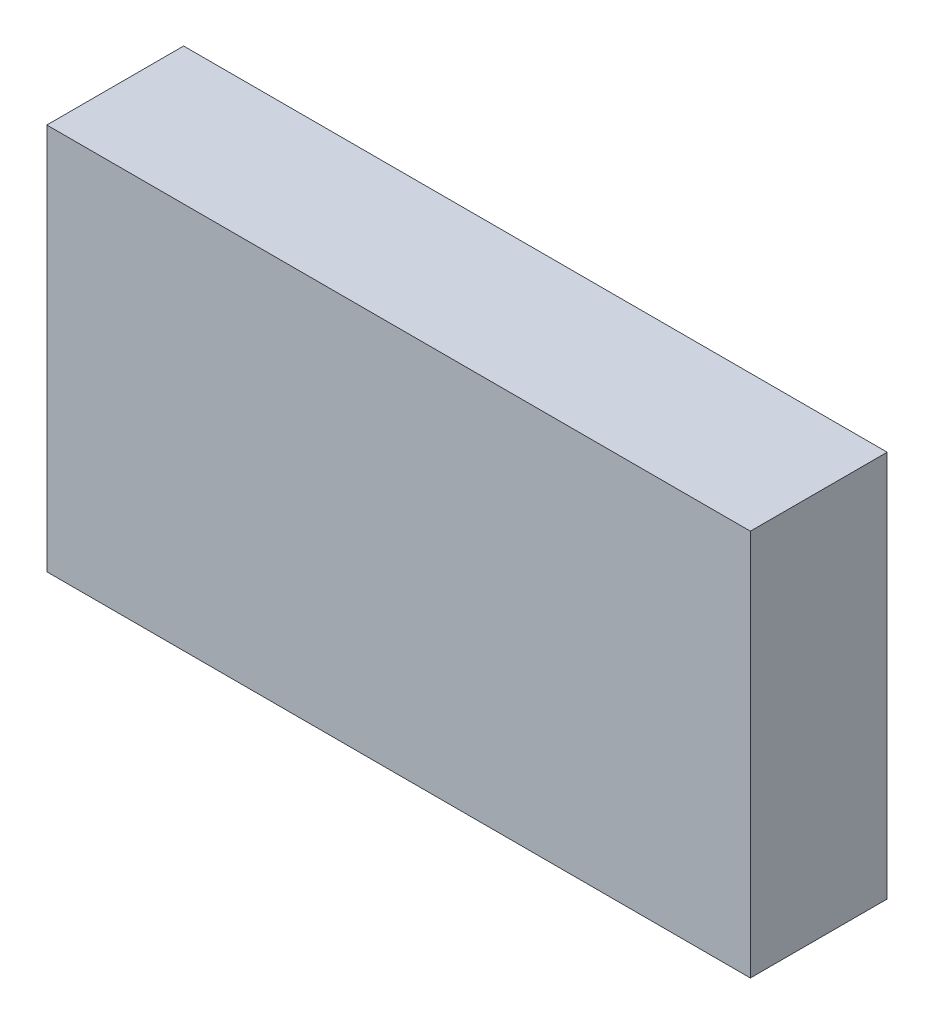
ISO-10303-21;
HEADER;
FILE_DESCRIPTION(('STEP AP214'),'2;1');
FILE_NAME('part.step','',(''),(''),'','','');
FILE_SCHEMA(('AUTOMOTIVE_DESIGN { 1 0 10303 214 1 1 1 1 }'));
ENDSEC;
DATA;
#1=APPLICATION_CONTEXT('core data for automotive mechanical design processes');
#2=APPLICATION_PROTOCOL_DEFINITION('international standard','automotive_design',2000,#1);
#3=PRODUCT_CONTEXT('',#1,'mechanical');
#4=PRODUCT('Part','Part','',(#3));
#5=PRODUCT_RELATED_PRODUCT_CATEGORY('part','',(#4));
#6=PRODUCT_DEFINITION_FORMATION('','',#4);
#7=PRODUCT_DEFINITION_CONTEXT('part definition',#1,'design');
#8=PRODUCT_DEFINITION('design','',#6,#7);
#9=PRODUCT_DEFINITION_SHAPE('','',#8);
#10=(LENGTH_UNIT() NAMED_UNIT(*) SI_UNIT(.MILLI.,.METRE.));
#11=(NAMED_UNIT(*) PLANE_ANGLE_UNIT() SI_UNIT($,.RADIAN.));
#12=(NAMED_UNIT(*) SI_UNIT($,.STERADIAN.) SOLID_ANGLE_UNIT());
#13=UNCERTAINTY_MEASURE_WITH_UNIT(LENGTH_MEASURE(1.E-05),#10,'distance_accuracy_value','');
#14=(GEOMETRIC_REPRESENTATION_CONTEXT(3) GLOBAL_UNCERTAINTY_ASSIGNED_CONTEXT((#13)) GLOBAL_UNIT_ASSIGNED_CONTEXT((#10,
#11,#12)) REPRESENTATION_CONTEXT('',''));
#15=CARTESIAN_POINT('',(0.,0.,0.));
#16=DIRECTION('',(0.,0.,1.));
#17=DIRECTION('',(1.,0.,0.));
#18=AXIS2_PLACEMENT_3D('',#15,#16,#17);
#19=CARTESIAN_POINT('',(0.,0.,7.));
#20=DIRECTION('',(1.,0.,0.));
#21=DIRECTION('',(0.,1.,0.));
#22=AXIS2_PLACEMENT_3D('',#19,#20,#21);
#23=PLANE('',#22);
#24=DIRECTION('',(0.,-1.,0.));
#25=VECTOR('',#24,1.);
#26=CARTESIAN_POINT('',(0.,0.,0.));
#27=LINE('',#26,#25);
#28=CARTESIAN_POINT('',(0.,19.8,0.));
#29=VERTEX_POINT('',#28);
#30=CARTESIAN_POINT('',(0.,0.,0.));
#31=VERTEX_POINT('',#30);
#32=EDGE_CURVE('E111',#29,#31,#27,.T.);
#33=ORIENTED_EDGE('',*,*,#32,.T.);
#34=DIRECTION('',(0.,0.,-1.));
#35=VECTOR('',#34,1.);
#36=CARTESIAN_POINT('',(0.,0.,7.));
#37=LINE('',#36,#35);
#38=CARTESIAN_POINT('',(0.,0.,7.));
#39=VERTEX_POINT('',#38);
#40=EDGE_CURVE('E11',#39,#31,#37,.T.);
#41=ORIENTED_EDGE('',*,*,#40,.F.);
#42=DIRECTION('',(0.,-1.,0.));
#43=VECTOR('',#42,1.);
#44=CARTESIAN_POINT('',(0.,0.,7.));
#45=LINE('',#44,#43);
#46=CARTESIAN_POINT('',(0.,19.8,7.));
#47=VERTEX_POINT('',#46);
#48=EDGE_CURVE('E95',#47,#39,#45,.T.);
#49=ORIENTED_EDGE('',*,*,#48,.F.);
#50=DIRECTION('',(0.,0.,-1.));
#51=VECTOR('',#50,1.);
#52=CARTESIAN_POINT('',(0.,19.8,7.));
#53=LINE('',#52,#51);
#54=EDGE_CURVE('E107',#47,#29,#53,.T.);
#55=ORIENTED_EDGE('',*,*,#54,.T.);
#56=EDGE_LOOP('',(#33,#41,#49,#55));
#57=FACE_BOUND('',#56,.T.);
#58=ADVANCED_FACE('F43',(#57),#23,.F.);
#59=CARTESIAN_POINT('',(0.,0.,7.));
#60=DIRECTION('',(0.,1.,0.));
#61=DIRECTION('',(0.,0.,1.));
#62=AXIS2_PLACEMENT_3D('',#59,#60,#61);
#63=PLANE('',#62);
#64=DIRECTION('',(1.,0.,0.));
#65=VECTOR('',#64,1.);
#66=CARTESIAN_POINT('',(0.,0.,0.));
#67=LINE('',#66,#65);
#68=CARTESIAN_POINT('',(36.,0.,0.));
#69=VERTEX_POINT('',#68);
#70=EDGE_CURVE('E100',#31,#69,#67,.T.);
#71=ORIENTED_EDGE('',*,*,#70,.T.);
#72=DIRECTION('',(0.,0.,-1.));
#73=VECTOR('',#72,1.);
#74=CARTESIAN_POINT('',(36.,0.,7.));
#75=LINE('',#74,#73);
#76=CARTESIAN_POINT('',(36.,0.,7.));
#77=VERTEX_POINT('',#76);
#78=EDGE_CURVE('E52',#77,#69,#75,.T.);
#79=ORIENTED_EDGE('',*,*,#78,.F.);
#80=DIRECTION('',(1.,0.,0.));
#81=VECTOR('',#80,1.);
#82=CARTESIAN_POINT('',(0.,0.,7.));
#83=LINE('',#82,#81);
#84=EDGE_CURVE('E90',#39,#77,#83,.T.);
#85=ORIENTED_EDGE('',*,*,#84,.F.);
#86=ORIENTED_EDGE('',*,*,#40,.T.);
#87=EDGE_LOOP('',(#71,#79,#85,#86));
#88=FACE_BOUND('',#87,.T.);
#89=ADVANCED_FACE('F99',(#88),#63,.F.);
#90=CARTESIAN_POINT('',(36.,0.,7.));
#91=DIRECTION('',(-1.,0.,0.));
#92=DIRECTION('',(0.,-1.,0.));
#93=AXIS2_PLACEMENT_3D('',#90,#91,#92);
#94=PLANE('',#93);
#95=DIRECTION('',(0.,1.,0.));
#96=VECTOR('',#95,1.);
#97=CARTESIAN_POINT('',(36.,0.,0.));
#98=LINE('',#97,#96);
#99=CARTESIAN_POINT('',(36.,19.8,0.));
#100=VERTEX_POINT('',#99);
#101=EDGE_CURVE('E77',#69,#100,#98,.T.);
#102=ORIENTED_EDGE('',*,*,#101,.T.);
#103=DIRECTION('',(0.,0.,-1.));
#104=VECTOR('',#103,1.);
#105=CARTESIAN_POINT('',(36.,19.8,7.));
#106=LINE('',#105,#104);
#107=CARTESIAN_POINT('',(36.,19.8,7.));
#108=VERTEX_POINT('',#107);
#109=EDGE_CURVE('E102',#108,#100,#106,.T.);
#110=ORIENTED_EDGE('',*,*,#109,.F.);
#111=DIRECTION('',(0.,1.,0.));
#112=VECTOR('',#111,1.);
#113=CARTESIAN_POINT('',(36.,0.,7.));
#114=LINE('',#113,#112);
#115=EDGE_CURVE('E93',#77,#108,#114,.T.);
#116=ORIENTED_EDGE('',*,*,#115,.F.);
#117=ORIENTED_EDGE('',*,*,#78,.T.);
#118=EDGE_LOOP('',(#102,#110,#116,#117));
#119=FACE_BOUND('',#118,.T.);
#120=ADVANCED_FACE('F103',(#119),#94,.F.);
#121=CARTESIAN_POINT('',(0.,19.8,7.));
#122=DIRECTION('',(0.,-1.,0.));
#123=DIRECTION('',(0.,0.,-1.));
#124=AXIS2_PLACEMENT_3D('',#121,#122,#123);
#125=PLANE('',#124);
#126=DIRECTION('',(-1.,0.,0.));
#127=VECTOR('',#126,1.);
#128=CARTESIAN_POINT('',(0.,19.8,0.));
#129=LINE('',#128,#127);
#130=EDGE_CURVE('E83',#100,#29,#129,.T.);
#131=ORIENTED_EDGE('',*,*,#130,.T.);
#132=ORIENTED_EDGE('',*,*,#54,.F.);
#133=DIRECTION('',(-1.,0.,0.));
#134=VECTOR('',#133,1.);
#135=CARTESIAN_POINT('',(0.,19.8,7.));
#136=LINE('',#135,#134);
#137=EDGE_CURVE('E60',#108,#47,#136,.T.);
#138=ORIENTED_EDGE('',*,*,#137,.F.);
#139=ORIENTED_EDGE('',*,*,#109,.T.);
#140=EDGE_LOOP('',(#131,#132,#138,#139));
#141=FACE_BOUND('',#140,.T.);
#142=ADVANCED_FACE('F124',(#141),#125,.F.);
#143=CARTESIAN_POINT('',(0.,0.,7.));
#144=DIRECTION('',(0.,0.,-1.));
#145=DIRECTION('',(-1.,0.,0.));
#146=AXIS2_PLACEMENT_3D('',#143,#144,#145);
#147=PLANE('',#146);
#148=ORIENTED_EDGE('',*,*,#48,.T.);
#149=ORIENTED_EDGE('',*,*,#84,.T.);
#150=ORIENTED_EDGE('',*,*,#115,.T.);
#151=ORIENTED_EDGE('',*,*,#137,.T.);
#152=EDGE_LOOP('',(#148,#149,#150,#151));
#153=FACE_BOUND('',#152,.T.);
#154=ADVANCED_FACE('F91',(#153),#147,.F.);
#155=CARTESIAN_POINT('',(0.,0.,0.));
#156=DIRECTION('',(0.,0.,-1.));
#157=DIRECTION('',(-1.,0.,0.));
#158=AXIS2_PLACEMENT_3D('',#155,#156,#157);
#159=PLANE('',#158);
#160=ORIENTED_EDGE('',*,*,#32,.F.);
#161=ORIENTED_EDGE('',*,*,#130,.F.);
#162=ORIENTED_EDGE('',*,*,#101,.F.);
#163=ORIENTED_EDGE('',*,*,#70,.F.);
#164=EDGE_LOOP('',(#160,#161,#162,#163));
#165=FACE_BOUND('',#164,.T.);
#166=ADVANCED_FACE('F127',(#165),#159,.T.);
#167=CLOSED_SHELL('',(#58,#89,#120,#142,#154,#166));
#168=MANIFOLD_SOLID_BREP('B2',#167);
#169=ADVANCED_BREP_SHAPE_REPRESENTATION('',(#18,#168),#14);
#170=SHAPE_DEFINITION_REPRESENTATION(#9,#169);
ENDSEC;
END-ISO-10303-21;
